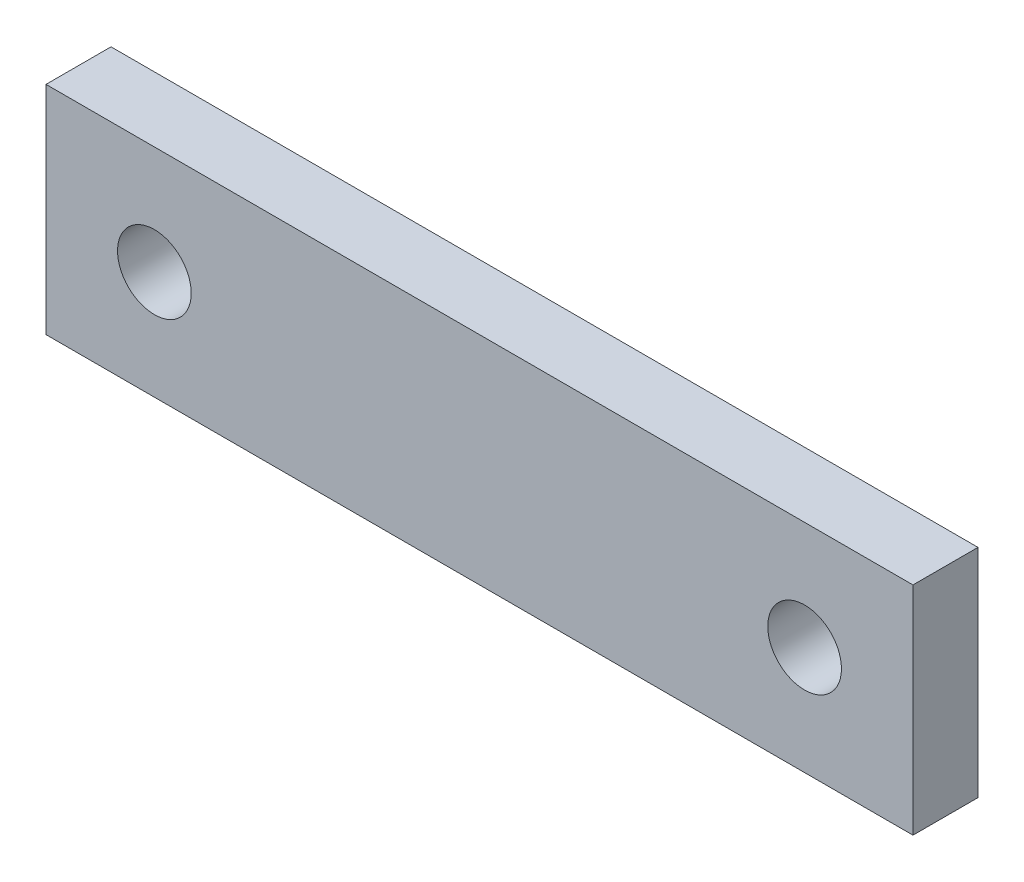
ISO-10303-21;
HEADER;
FILE_DESCRIPTION(('STEP AP214'),'2;1');
FILE_NAME('part.step','',(''),(''),'','','');
FILE_SCHEMA(('AUTOMOTIVE_DESIGN { 1 0 10303 214 1 1 1 1 }'));
ENDSEC;
DATA;
#1=APPLICATION_CONTEXT('core data for automotive mechanical design processes');
#2=APPLICATION_PROTOCOL_DEFINITION('international standard','automotive_design',2000,#1);
#3=PRODUCT_CONTEXT('',#1,'mechanical');
#4=PRODUCT('Part','Part','',(#3));
#5=PRODUCT_RELATED_PRODUCT_CATEGORY('part','',(#4));
#6=PRODUCT_DEFINITION_FORMATION('','',#4);
#7=PRODUCT_DEFINITION_CONTEXT('part definition',#1,'design');
#8=PRODUCT_DEFINITION('design','',#6,#7);
#9=PRODUCT_DEFINITION_SHAPE('','',#8);
#10=(LENGTH_UNIT() NAMED_UNIT(*) SI_UNIT(.MILLI.,.METRE.));
#11=(NAMED_UNIT(*) PLANE_ANGLE_UNIT() SI_UNIT($,.RADIAN.));
#12=(NAMED_UNIT(*) SI_UNIT($,.STERADIAN.) SOLID_ANGLE_UNIT());
#13=UNCERTAINTY_MEASURE_WITH_UNIT(LENGTH_MEASURE(1.E-05),#10,'distance_accuracy_value','');
#14=(GEOMETRIC_REPRESENTATION_CONTEXT(3) GLOBAL_UNCERTAINTY_ASSIGNED_CONTEXT((#13)) GLOBAL_UNIT_ASSIGNED_CONTEXT((#10,
#11,#12)) REPRESENTATION_CONTEXT('',''));
#15=CARTESIAN_POINT('',(0.,0.,0.));
#16=DIRECTION('',(0.,0.,1.));
#17=DIRECTION('',(1.,0.,0.));
#18=AXIS2_PLACEMENT_3D('',#15,#16,#17);
#19=CARTESIAN_POINT('',(-130.,-31.5,41.5));
#20=DIRECTION('',(-1.,0.,0.));
#21=DIRECTION('',(0.,0.,1.));
#22=AXIS2_PLACEMENT_3D('',#19,#20,#21);
#23=PLANE('',#22);
#24=DIRECTION('',(0.,-1.,0.));
#25=VECTOR('',#24,1.);
#26=CARTESIAN_POINT('',(-130.,-31.5,44.5));
#27=LINE('',#26,#25);
#28=CARTESIAN_POINT('',(-130.,-31.5,44.5));
#29=VERTEX_POINT('',#28);
#30=CARTESIAN_POINT('',(-130.,-41.5,44.5));
#31=VERTEX_POINT('',#30);
#32=EDGE_CURVE('E106',#29,#31,#27,.T.);
#33=ORIENTED_EDGE('',*,*,#32,.F.);
#34=DIRECTION('',(0.,0.,1.));
#35=VECTOR('',#34,1.);
#36=CARTESIAN_POINT('',(-130.,-31.5,41.5));
#37=LINE('',#36,#35);
#38=CARTESIAN_POINT('',(-130.,-31.5,41.5));
#39=VERTEX_POINT('',#38);
#40=EDGE_CURVE('E11',#39,#29,#37,.T.);
#41=ORIENTED_EDGE('',*,*,#40,.F.);
#42=DIRECTION('',(0.,-1.,0.));
#43=VECTOR('',#42,1.);
#44=CARTESIAN_POINT('',(-130.,-31.5,41.5));
#45=LINE('',#44,#43);
#46=CARTESIAN_POINT('',(-130.,-41.5,41.5));
#47=VERTEX_POINT('',#46);
#48=EDGE_CURVE('E97',#39,#47,#45,.T.);
#49=ORIENTED_EDGE('',*,*,#48,.T.);
#50=DIRECTION('',(0.,0.,1.));
#51=VECTOR('',#50,1.);
#52=CARTESIAN_POINT('',(-130.,-41.5,41.5));
#53=LINE('',#52,#51);
#54=EDGE_CURVE('E42',#47,#31,#53,.T.);
#55=ORIENTED_EDGE('',*,*,#54,.T.);
#56=EDGE_LOOP('',(#33,#41,#49,#55));
#57=FACE_BOUND('',#56,.T.);
#58=ADVANCED_FACE('F41',(#57),#23,.T.);
#59=CARTESIAN_POINT('',(-130.,-31.5,41.5));
#60=DIRECTION('',(0.,1.,0.));
#61=DIRECTION('',(0.,0.,1.));
#62=AXIS2_PLACEMENT_3D('',#59,#60,#61);
#63=PLANE('',#62);
#64=DIRECTION('',(-1.,0.,0.));
#65=VECTOR('',#64,1.);
#66=CARTESIAN_POINT('',(-130.,-31.5,44.5));
#67=LINE('',#66,#65);
#68=CARTESIAN_POINT('',(-90.,-31.5,44.5));
#69=VERTEX_POINT('',#68);
#70=EDGE_CURVE('E101',#69,#29,#67,.T.);
#71=ORIENTED_EDGE('',*,*,#70,.F.);
#72=DIRECTION('',(0.,0.,1.));
#73=VECTOR('',#72,1.);
#74=CARTESIAN_POINT('',(-90.,-31.5,41.5));
#75=LINE('',#74,#73);
#76=CARTESIAN_POINT('',(-90.,-31.5,41.5));
#77=VERTEX_POINT('',#76);
#78=EDGE_CURVE('E49',#77,#69,#75,.T.);
#79=ORIENTED_EDGE('',*,*,#78,.F.);
#80=DIRECTION('',(-1.,0.,0.));
#81=VECTOR('',#80,1.);
#82=CARTESIAN_POINT('',(-130.,-31.5,41.5));
#83=LINE('',#82,#81);
#84=EDGE_CURVE('E96',#77,#39,#83,.T.);
#85=ORIENTED_EDGE('',*,*,#84,.T.);
#86=ORIENTED_EDGE('',*,*,#40,.T.);
#87=EDGE_LOOP('',(#71,#79,#85,#86));
#88=FACE_BOUND('',#87,.T.);
#89=ADVANCED_FACE('F120',(#88),#63,.T.);
#90=CARTESIAN_POINT('',(-90.,-31.5,41.5));
#91=DIRECTION('',(1.,0.,0.));
#92=DIRECTION('',(0.,0.,-1.));
#93=AXIS2_PLACEMENT_3D('',#90,#91,#92);
#94=PLANE('',#93);
#95=DIRECTION('',(0.,1.,0.));
#96=VECTOR('',#95,1.);
#97=CARTESIAN_POINT('',(-90.,-31.5,44.5));
#98=LINE('',#97,#96);
#99=CARTESIAN_POINT('',(-90.,-41.5,44.5));
#100=VERTEX_POINT('',#99);
#101=EDGE_CURVE('E93',#100,#69,#98,.T.);
#102=ORIENTED_EDGE('',*,*,#101,.F.);
#103=DIRECTION('',(0.,0.,1.));
#104=VECTOR('',#103,1.);
#105=CARTESIAN_POINT('',(-90.,-41.5,41.5));
#106=LINE('',#105,#104);
#107=CARTESIAN_POINT('',(-90.,-41.5,41.5));
#108=VERTEX_POINT('',#107);
#109=EDGE_CURVE('E88',#108,#100,#106,.T.);
#110=ORIENTED_EDGE('',*,*,#109,.F.);
#111=DIRECTION('',(0.,1.,0.));
#112=VECTOR('',#111,1.);
#113=CARTESIAN_POINT('',(-90.,-31.5,41.5));
#114=LINE('',#113,#112);
#115=EDGE_CURVE('E90',#108,#77,#114,.T.);
#116=ORIENTED_EDGE('',*,*,#115,.T.);
#117=ORIENTED_EDGE('',*,*,#78,.T.);
#118=EDGE_LOOP('',(#102,#110,#116,#117));
#119=FACE_BOUND('',#118,.T.);
#120=ADVANCED_FACE('F86',(#119),#94,.T.);
#121=CARTESIAN_POINT('',(-130.,-41.5,41.5));
#122=DIRECTION('',(0.,-1.,0.));
#123=DIRECTION('',(0.,0.,-1.));
#124=AXIS2_PLACEMENT_3D('',#121,#122,#123);
#125=PLANE('',#124);
#126=DIRECTION('',(1.,0.,0.));
#127=VECTOR('',#126,1.);
#128=CARTESIAN_POINT('',(-130.,-41.5,44.5));
#129=LINE('',#128,#127);
#130=EDGE_CURVE('E108',#31,#100,#129,.T.);
#131=ORIENTED_EDGE('',*,*,#130,.F.);
#132=ORIENTED_EDGE('',*,*,#54,.F.);
#133=DIRECTION('',(1.,0.,0.));
#134=VECTOR('',#133,1.);
#135=CARTESIAN_POINT('',(-130.,-41.5,41.5));
#136=LINE('',#135,#134);
#137=EDGE_CURVE('E92',#47,#108,#136,.T.);
#138=ORIENTED_EDGE('',*,*,#137,.T.);
#139=ORIENTED_EDGE('',*,*,#109,.T.);
#140=EDGE_LOOP('',(#131,#132,#138,#139));
#141=FACE_BOUND('',#140,.T.);
#142=ADVANCED_FACE('F98',(#141),#125,.T.);
#143=CARTESIAN_POINT('',(0.,0.,41.5));
#144=DIRECTION('',(0.,0.,1.));
#145=DIRECTION('',(1.,0.,0.));
#146=AXIS2_PLACEMENT_3D('',#143,#144,#145);
#147=PLANE('',#146);
#148=CARTESIAN_POINT('',(-95.,-36.5,41.5));
#149=DIRECTION('',(0.,0.,1.));
#150=DIRECTION('',(1.,0.,0.));
#151=AXIS2_PLACEMENT_3D('',#148,#149,#150);
#152=CIRCLE('',#151,1.69999999999999);
#153=CARTESIAN_POINT('',(-93.3,-36.5,41.5));
#154=VERTEX_POINT('',#153);
#155=EDGE_CURVE('E147',#154,#154,#152,.T.);
#156=ORIENTED_EDGE('',*,*,#155,.T.);
#157=EDGE_LOOP('',(#156));
#158=FACE_BOUND('',#157,.T.);
#159=CARTESIAN_POINT('',(-125.,-36.5,41.5));
#160=DIRECTION('',(0.,0.,1.));
#161=DIRECTION('',(1.,0.,0.));
#162=AXIS2_PLACEMENT_3D('',#159,#160,#161);
#163=CIRCLE('',#162,1.69999999999999);
#164=CARTESIAN_POINT('',(-123.3,-36.5,41.5));
#165=VERTEX_POINT('',#164);
#166=EDGE_CURVE('E109',#165,#165,#163,.T.);
#167=ORIENTED_EDGE('',*,*,#166,.T.);
#168=EDGE_LOOP('',(#167));
#169=FACE_BOUND('',#168,.T.);
#170=ORIENTED_EDGE('',*,*,#48,.F.);
#171=ORIENTED_EDGE('',*,*,#84,.F.);
#172=ORIENTED_EDGE('',*,*,#115,.F.);
#173=ORIENTED_EDGE('',*,*,#137,.F.);
#174=EDGE_LOOP('',(#170,#171,#172,#173));
#175=FACE_BOUND('',#174,.T.);
#176=ADVANCED_FACE('F94',(#158,#169,#175),#147,.F.);
#177=CARTESIAN_POINT('',(0.,0.,44.5));
#178=DIRECTION('',(0.,0.,1.));
#179=DIRECTION('',(1.,0.,0.));
#180=AXIS2_PLACEMENT_3D('',#177,#178,#179);
#181=PLANE('',#180);
#182=CARTESIAN_POINT('',(-95.,-36.5,44.5));
#183=DIRECTION('',(0.,0.,1.));
#184=DIRECTION('',(1.,0.,0.));
#185=AXIS2_PLACEMENT_3D('',#182,#183,#184);
#186=CIRCLE('',#185,1.69999999999999);
#187=CARTESIAN_POINT('',(-93.3,-36.5,44.5));
#188=VERTEX_POINT('',#187);
#189=EDGE_CURVE('E153',#188,#188,#186,.T.);
#190=ORIENTED_EDGE('',*,*,#189,.F.);
#191=EDGE_LOOP('',(#190));
#192=FACE_BOUND('',#191,.T.);
#193=CARTESIAN_POINT('',(-125.,-36.5,44.5));
#194=DIRECTION('',(0.,0.,1.));
#195=DIRECTION('',(1.,0.,0.));
#196=AXIS2_PLACEMENT_3D('',#193,#194,#195);
#197=CIRCLE('',#196,1.69999999999999);
#198=CARTESIAN_POINT('',(-123.3,-36.5,44.5));
#199=VERTEX_POINT('',#198);
#200=EDGE_CURVE('E154',#199,#199,#197,.T.);
#201=ORIENTED_EDGE('',*,*,#200,.F.);
#202=EDGE_LOOP('',(#201));
#203=FACE_BOUND('',#202,.T.);
#204=ORIENTED_EDGE('',*,*,#32,.T.);
#205=ORIENTED_EDGE('',*,*,#130,.T.);
#206=ORIENTED_EDGE('',*,*,#101,.T.);
#207=ORIENTED_EDGE('',*,*,#70,.T.);
#208=EDGE_LOOP('',(#204,#205,#206,#207));
#209=FACE_BOUND('',#208,.T.);
#210=ADVANCED_FACE('F117',(#192,#203,#209),#181,.T.);
#211=CARTESIAN_POINT('',(-125.,-36.5,41.5));
#212=DIRECTION('',(0.,0.,1.));
#213=DIRECTION('',(1.,0.,0.));
#214=AXIS2_PLACEMENT_3D('',#211,#212,#213);
#215=CYLINDRICAL_SURFACE('',#214,1.69999999999999);
#216=ORIENTED_EDGE('',*,*,#166,.F.);
#217=EDGE_LOOP('',(#216));
#218=FACE_BOUND('',#217,.T.);
#219=ORIENTED_EDGE('',*,*,#200,.T.);
#220=EDGE_LOOP('',(#219));
#221=FACE_BOUND('',#220,.T.);
#222=ADVANCED_FACE('F133',(#218,#221),#215,.F.);
#223=CARTESIAN_POINT('',(-95.,-36.5,41.5));
#224=DIRECTION('',(0.,0.,1.));
#225=DIRECTION('',(1.,0.,0.));
#226=AXIS2_PLACEMENT_3D('',#223,#224,#225);
#227=CYLINDRICAL_SURFACE('',#226,1.69999999999999);
#228=ORIENTED_EDGE('',*,*,#155,.F.);
#229=EDGE_LOOP('',(#228));
#230=FACE_BOUND('',#229,.T.);
#231=ORIENTED_EDGE('',*,*,#189,.T.);
#232=EDGE_LOOP('',(#231));
#233=FACE_BOUND('',#232,.T.);
#234=ADVANCED_FACE('F142',(#230,#233),#227,.F.);
#235=CLOSED_SHELL('',(#58,#89,#120,#142,#176,#210,#222,#234));
#236=MANIFOLD_SOLID_BREP('B2',#235);
#237=ADVANCED_BREP_SHAPE_REPRESENTATION('',(#18,#236),#14);
#238=SHAPE_DEFINITION_REPRESENTATION(#9,#237);
ENDSEC;
END-ISO-10303-21;
